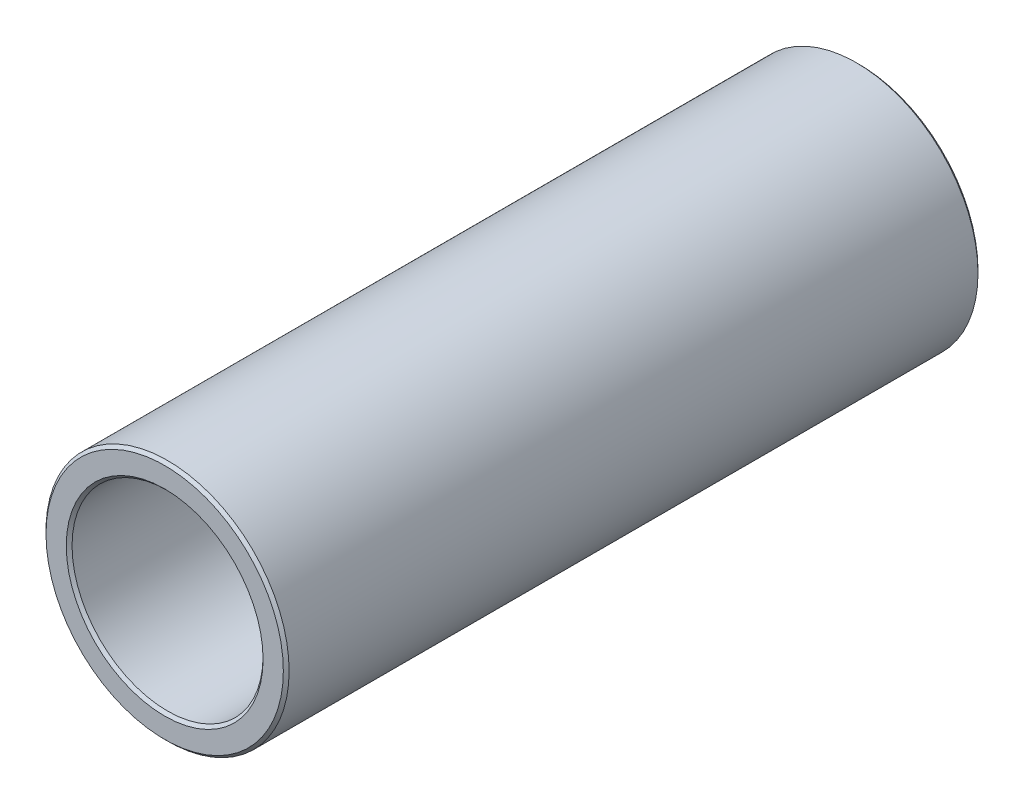
ISO-10303-21;
HEADER;
FILE_DESCRIPTION(('STEP AP214'),'2;1');
FILE_NAME('part.step','',(''),(''),'','','');
FILE_SCHEMA(('AUTOMOTIVE_DESIGN { 1 0 10303 214 1 1 1 1 }'));
ENDSEC;
DATA;
#1=APPLICATION_CONTEXT('core data for automotive mechanical design processes');
#2=APPLICATION_PROTOCOL_DEFINITION('international standard','automotive_design',2000,#1);
#3=PRODUCT_CONTEXT('',#1,'mechanical');
#4=PRODUCT('Part','Part','',(#3));
#5=PRODUCT_RELATED_PRODUCT_CATEGORY('part','',(#4));
#6=PRODUCT_DEFINITION_FORMATION('','',#4);
#7=PRODUCT_DEFINITION_CONTEXT('part definition',#1,'design');
#8=PRODUCT_DEFINITION('design','',#6,#7);
#9=PRODUCT_DEFINITION_SHAPE('','',#8);
#10=(LENGTH_UNIT() NAMED_UNIT(*) SI_UNIT(.MILLI.,.METRE.));
#11=(NAMED_UNIT(*) PLANE_ANGLE_UNIT() SI_UNIT($,.RADIAN.));
#12=(NAMED_UNIT(*) SI_UNIT($,.STERADIAN.) SOLID_ANGLE_UNIT());
#13=UNCERTAINTY_MEASURE_WITH_UNIT(LENGTH_MEASURE(1.E-05),#10,'distance_accuracy_value','');
#14=(GEOMETRIC_REPRESENTATION_CONTEXT(3) GLOBAL_UNCERTAINTY_ASSIGNED_CONTEXT((#13)) GLOBAL_UNIT_ASSIGNED_CONTEXT((#10,
#11,#12)) REPRESENTATION_CONTEXT('',''));
#15=CARTESIAN_POINT('',(0.,0.,0.));
#16=DIRECTION('',(0.,0.,1.));
#17=DIRECTION('',(1.,0.,0.));
#18=AXIS2_PLACEMENT_3D('',#15,#16,#17);
#19=CARTESIAN_POINT('',(0.,-3.33066907387547E-13,119.999999999999));
#20=DIRECTION('',(0.,0.,-0.999999999999981));
#21=DIRECTION('',(-1.00000000000002,0.,0.));
#22=AXIS2_PLACEMENT_3D('',#19,#20,#21);
#23=PLANE('',#22);
#24=CARTESIAN_POINT('',(0.,-3.33066907387547E-13,119.999999999999));
#25=DIRECTION('',(0.,0.,0.999999999999981));
#26=DIRECTION('',(1.00000000000002,0.,0.));
#27=AXIS2_PLACEMENT_3D('',#24,#25,#26);
#28=CIRCLE('',#27,20.5);
#29=CARTESIAN_POINT('',(20.5000000000003,-3.54688500792122E-13,119.999999999999));
#30=VERTEX_POINT('',#29);
#31=EDGE_CURVE('E52',#30,#30,#28,.T.);
#32=ORIENTED_EDGE('',*,*,#31,.T.);
#33=EDGE_LOOP('',(#32));
#34=FACE_BOUND('',#33,.T.);
#35=CARTESIAN_POINT('',(0.,-3.33066907387547E-13,119.999999999999));
#36=DIRECTION('',(0.,0.,0.999999999999981));
#37=DIRECTION('',(1.00000000000002,0.,0.));
#38=AXIS2_PLACEMENT_3D('',#35,#36,#37);
#39=CIRCLE('',#38,17.);
#40=CARTESIAN_POINT('',(16.9999999999999,-1.84478109588686E-13,119.999999999999));
#41=VERTEX_POINT('',#40);
#42=EDGE_CURVE('E74',#41,#41,#39,.T.);
#43=ORIENTED_EDGE('',*,*,#42,.F.);
#44=EDGE_LOOP('',(#43));
#45=FACE_BOUND('',#44,.T.);
#46=ADVANCED_FACE('F46',(#34,#45),#23,.F.);
#47=CARTESIAN_POINT('',(-7.63278329429795E-13,20.9999999999997,1.0547118733939E-12));
#48=DIRECTION('',(0.,0.,0.999999999999981));
#49=DIRECTION('',(1.00000000000002,0.,0.));
#50=AXIS2_PLACEMENT_3D('',#47,#48,#49);
#51=PLANE('',#50);
#52=CARTESIAN_POINT('',(0.,0.,0.));
#53=DIRECTION('',(0.,0.,0.999999999999981));
#54=DIRECTION('',(1.00000000000002,0.,0.));
#55=AXIS2_PLACEMENT_3D('',#52,#53,#54);
#56=CIRCLE('',#55,20.5);
#57=CARTESIAN_POINT('',(20.4999999999998,1.44926414336415E-13,0.));
#58=VERTEX_POINT('',#57);
#59=EDGE_CURVE('E56',#58,#58,#56,.T.);
#60=ORIENTED_EDGE('',*,*,#59,.F.);
#61=EDGE_LOOP('',(#60));
#62=FACE_BOUND('',#61,.T.);
#63=CARTESIAN_POINT('',(0.,0.,0.));
#64=DIRECTION('',(0.,0.,0.999999999999981));
#65=DIRECTION('',(1.00000000000002,0.,0.));
#66=AXIS2_PLACEMENT_3D('',#63,#64,#65);
#67=CIRCLE('',#66,8.);
#68=CARTESIAN_POINT('',(8.00000000000012,0.,0.));
#69=VERTEX_POINT('',#68);
#70=EDGE_CURVE('E71',#69,#69,#67,.T.);
#71=ORIENTED_EDGE('',*,*,#70,.T.);
#72=EDGE_LOOP('',(#71));
#73=FACE_BOUND('',#72,.T.);
#74=ADVANCED_FACE('F99',(#62,#73),#51,.F.);
#75=CARTESIAN_POINT('',(0.,0.,0.));
#76=DIRECTION('',(0.,0.,0.999999999999981));
#77=DIRECTION('',(1.00000000000002,0.,0.));
#78=AXIS2_PLACEMENT_3D('',#75,#76,#77);
#79=CYLINDRICAL_SURFACE('',#78,21.);
#80=CARTESIAN_POINT('',(-2.63677968348475E-13,-1.66533453693773E-13,119.499999999999));
#81=DIRECTION('',(0.,0.,0.999999999999981));
#82=DIRECTION('',(1.00000000000002,0.,0.));
#83=AXIS2_PLACEMENT_3D('',#80,#81,#82);
#84=CIRCLE('',#83,21.);
#85=CARTESIAN_POINT('',(21.0000000000006,0.,119.499999999999));
#86=VERTEX_POINT('',#85);
#87=EDGE_CURVE('E12',#86,#86,#84,.T.);
#88=CARTESIAN_POINT('',(-3.88578058618805E-13,1.66533453693773E-13,0.5));
#89=DIRECTION('',(0.,0.,0.999999999999981));
#90=DIRECTION('',(1.00000000000002,0.,0.));
#91=AXIS2_PLACEMENT_3D('',#88,#89,#90);
#92=CIRCLE('',#91,21.);
#93=CARTESIAN_POINT('',(21.0000000000003,0.,0.499999999999955));
#94=VERTEX_POINT('',#93);
#95=EDGE_CURVE('E60',#94,#94,#92,.T.);
#96=CARTESIAN_POINT('',(21.0000000000006,0.,119.499999999999));
#97=CARTESIAN_POINT('',(21.0000000000006,0.,118.260416666665));
#98=CARTESIAN_POINT('',(21.0000000000006,0.,117.020833333332));
#99=CARTESIAN_POINT('',(21.0000000000006,0.,114.541666666665));
#100=CARTESIAN_POINT('',(21.0000000000006,0.,113.302083333332));
#101=CARTESIAN_POINT('',(21.0000000000006,0.,110.822916666665));
#102=CARTESIAN_POINT('',(21.0000000000006,0.,109.583333333332));
#103=CARTESIAN_POINT('',(21.0000000000006,0.,107.104166666665));
#104=CARTESIAN_POINT('',(21.0000000000006,0.,105.864583333332));
#105=CARTESIAN_POINT('',(21.0000000000005,0.,103.385416666665));
#106=CARTESIAN_POINT('',(21.0000000000005,0.,102.145833333332));
#107=CARTESIAN_POINT('',(21.0000000000005,0.,99.6666666666655));
#108=CARTESIAN_POINT('',(21.0000000000005,0.,98.4270833333322));
#109=CARTESIAN_POINT('',(21.0000000000005,0.,95.9479166666655));
#110=CARTESIAN_POINT('',(21.0000000000005,0.,94.7083333333322));
#111=CARTESIAN_POINT('',(21.0000000000005,0.,92.2291666666656));
#112=CARTESIAN_POINT('',(21.0000000000005,0.,90.9895833333323));
#113=CARTESIAN_POINT('',(21.0000000000005,0.,88.5104166666656));
#114=CARTESIAN_POINT('',(21.0000000000005,0.,87.2708333333323));
#115=CARTESIAN_POINT('',(21.0000000000005,0.,84.7916666666657));
#116=CARTESIAN_POINT('',(21.0000000000005,0.,83.5520833333323));
#117=CARTESIAN_POINT('',(21.0000000000005,0.,81.0729166666657));
#118=CARTESIAN_POINT('',(21.0000000000005,0.,79.8333333333324));
#119=CARTESIAN_POINT('',(21.0000000000005,0.,77.3541666666657));
#120=CARTESIAN_POINT('',(21.0000000000005,0.,76.1145833333324));
#121=CARTESIAN_POINT('',(21.0000000000005,0.,73.6354166666658));
#122=CARTESIAN_POINT('',(21.0000000000005,0.,72.3958333333325));
#123=CARTESIAN_POINT('',(21.0000000000005,0.,69.9166666666658));
#124=CARTESIAN_POINT('',(21.0000000000005,0.,68.6770833333325));
#125=CARTESIAN_POINT('',(21.0000000000005,0.,66.1979166666659));
#126=CARTESIAN_POINT('',(21.0000000000005,0.,64.9583333333326));
#127=CARTESIAN_POINT('',(21.0000000000005,0.,62.4791666666659));
#128=CARTESIAN_POINT('',(21.0000000000005,0.,61.2395833333326));
#129=CARTESIAN_POINT('',(21.0000000000004,0.,58.760416666666));
#130=CARTESIAN_POINT('',(21.0000000000004,0.,57.5208333333326));
#131=CARTESIAN_POINT('',(21.0000000000004,0.,55.041666666666));
#132=CARTESIAN_POINT('',(21.0000000000004,0.,53.8020833333327));
#133=CARTESIAN_POINT('',(21.0000000000004,0.,51.3229166666661));
#134=CARTESIAN_POINT('',(21.0000000000004,0.,50.0833333333327));
#135=CARTESIAN_POINT('',(21.0000000000004,0.,47.6041666666661));
#136=CARTESIAN_POINT('',(21.0000000000004,0.,46.3645833333328));
#137=CARTESIAN_POINT('',(21.0000000000004,0.,43.8854166666661));
#138=CARTESIAN_POINT('',(21.0000000000004,0.,42.6458333333328));
#139=CARTESIAN_POINT('',(21.0000000000004,0.,40.1666666666662));
#140=CARTESIAN_POINT('',(21.0000000000004,0.,38.9270833333329));
#141=CARTESIAN_POINT('',(21.0000000000004,0.,36.4479166666662));
#142=CARTESIAN_POINT('',(21.0000000000004,0.,35.2083333333329));
#143=CARTESIAN_POINT('',(21.0000000000004,0.,32.7291666666663));
#144=CARTESIAN_POINT('',(21.0000000000004,0.,31.4895833333329));
#145=CARTESIAN_POINT('',(21.0000000000004,0.,29.0104166666663));
#146=CARTESIAN_POINT('',(21.0000000000004,0.,27.770833333333));
#147=CARTESIAN_POINT('',(21.0000000000004,0.,25.2916666666663));
#148=CARTESIAN_POINT('',(21.0000000000004,0.,24.052083333333));
#149=CARTESIAN_POINT('',(21.0000000000004,0.,21.5729166666664));
#150=CARTESIAN_POINT('',(21.0000000000004,0.,20.3333333333331));
#151=CARTESIAN_POINT('',(21.0000000000004,0.,17.8541666666664));
#152=CARTESIAN_POINT('',(21.0000000000004,0.,16.6145833333331));
#153=CARTESIAN_POINT('',(21.0000000000003,0.,14.1354166666665));
#154=CARTESIAN_POINT('',(21.0000000000003,0.,12.8958333333331));
#155=CARTESIAN_POINT('',(21.0000000000003,0.,10.4166666666665));
#156=CARTESIAN_POINT('',(21.0000000000003,0.,9.17708333333319));
#157=CARTESIAN_POINT('',(21.0000000000003,0.,6.69791666666655));
#158=CARTESIAN_POINT('',(21.0000000000003,0.,5.45833333333323));
#159=CARTESIAN_POINT('',(21.0000000000003,0.,2.9791666666666));
#160=CARTESIAN_POINT('',(21.0000000000003,0.,1.73958333333328));
#161=CARTESIAN_POINT('',(21.0000000000003,0.,0.499999999999953));
#162=B_SPLINE_CURVE_WITH_KNOTS('',3,(#96,#97,#98,#99,#100,#101,#102,#103,#104,#105,#106,#107,
#108,#109,#110,#111,#112,#113,#114,#115,#116,#117,#118,#119,#120,#121,#122,#123,#124,#125,#126,
#127,#128,#129,#130,#131,#132,#133,#134,#135,#136,#137,#138,#139,#140,#141,#142,#143,#144,#145,
#146,#147,#148,#149,#150,#151,#152,#153,#154,#155,#156,#157,#158,#159,#160,#161),.UNSPECIFIED.,
.F.,.F.,(4,2,2,2,2,2,2,2,2,2,2,2,2,2,2,2,2,2,2,2,2,2,2,2,2,2,2,2,2,2,2,2,4),(0.,
3.71874999999995,7.4374999999999,11.1562499999999,14.8749999999998,18.5937499999998,
22.3124999999997,26.0312499999997,29.7499999999997,33.4687499999996,37.1874999999996,
40.9062499999995,44.6249999999995,48.3437499999995,52.0624999999994,55.7812499999994,
59.4999999999993,63.2187499999993,66.9374999999992,70.6562499999992,74.3749999999991,
78.0937499999991,81.8124999999991,85.531249999999,89.249999999999,92.9687499999989,
96.6874999999989,100.406249999999,104.124999999999,107.843749999999,111.562499999999,
115.281249999999,118.999999999999),.UNSPECIFIED.);
#163=EDGE_CURVE('BSEAM103',#86,#94,#162,.T.);
#164=ORIENTED_EDGE('',*,*,#87,.F.);
#165=ORIENTED_EDGE('',*,*,#95,.T.);
#166=ORIENTED_EDGE('',*,*,#163,.T.);
#167=ORIENTED_EDGE('',*,*,#163,.F.);
#168=EDGE_LOOP('',(#164,#166,#165,#167));
#169=FACE_BOUND('',#168,.T.);
#170=ADVANCED_FACE('F103',(#169),#79,.T.);
#171=CARTESIAN_POINT('',(0.,-3.33066907387547E-13,119.999999999999));
#172=DIRECTION('',(0.,0.,-0.999999999999981));
#173=DIRECTION('',(-1.00000000000002,0.,0.));
#174=AXIS2_PLACEMENT_3D('',#171,#172,#173);
#175=CONICAL_SURFACE('',#174,20.5,0.785398163397462);
#176=ORIENTED_EDGE('',*,*,#87,.T.);
#177=EDGE_LOOP('',(#176));
#178=FACE_BOUND('',#177,.T.);
#179=ORIENTED_EDGE('',*,*,#31,.F.);
#180=EDGE_LOOP('',(#179));
#181=FACE_BOUND('',#180,.T.);
#182=ADVANCED_FACE('F113',(#178,#181),#175,.T.);
#183=CARTESIAN_POINT('',(-3.88578058618805E-13,1.66533453693773E-13,0.5));
#184=DIRECTION('',(0.,0.,0.999999999999981));
#185=DIRECTION('',(1.00000000000002,0.,0.));
#186=AXIS2_PLACEMENT_3D('',#183,#184,#185);
#187=CONICAL_SURFACE('',#186,21.,0.785398163397449);
#188=CARTESIAN_POINT('',(20.4999999999998,1.44926414336415E-13,0.));
#189=CARTESIAN_POINT('',(20.5052083333332,1.44920769440749E-13,0.00520833333328914));
#190=CARTESIAN_POINT('',(20.5104166666665,1.44915124545083E-13,0.0104166666666223));
#191=CARTESIAN_POINT('',(20.5208333333332,1.44903834753752E-13,0.0208333333332885));
#192=CARTESIAN_POINT('',(20.5260416666665,1.44898189858086E-13,0.0260416666666217));
#193=CARTESIAN_POINT('',(20.5364583333332,1.44886900066754E-13,0.0364583333332886));
#194=CARTESIAN_POINT('',(20.5416666666665,1.44881255171089E-13,0.0416666666666223));
#195=CARTESIAN_POINT('',(20.5520833333332,1.44869965379757E-13,0.052083333333289));
#196=CARTESIAN_POINT('',(20.5572916666665,1.44864320484091E-13,0.0572916666666221));
#197=CARTESIAN_POINT('',(20.5677083333332,1.4485303069276E-13,0.0677083333332886));
#198=CARTESIAN_POINT('',(20.5729166666665,1.44847385797094E-13,0.072916666666622));
#199=CARTESIAN_POINT('',(20.5833333333332,1.44836096005763E-13,0.0833333333332886));
#200=CARTESIAN_POINT('',(20.5885416666665,1.44830451110097E-13,0.0885416666666216));
#201=CARTESIAN_POINT('',(20.5989583333332,1.44819161318765E-13,0.0989583333332884));
#202=CARTESIAN_POINT('',(20.6041666666665,1.448135164231E-13,0.104166666666622));
#203=CARTESIAN_POINT('',(20.6145833333332,1.44802226631768E-13,0.114583333333289));
#204=CARTESIAN_POINT('',(20.6197916666665,1.44796581736102E-13,0.119791666666622));
#205=CARTESIAN_POINT('',(20.6302083333332,1.44785291944771E-13,0.130208333333288));
#206=CARTESIAN_POINT('',(20.6354166666665,1.44779647049105E-13,0.135416666666622));
#207=CARTESIAN_POINT('',(20.6458333333332,1.44768357257774E-13,0.145833333333288));
#208=CARTESIAN_POINT('',(20.6510416666665,1.44762712362108E-13,0.151041666666622));
#209=CARTESIAN_POINT('',(20.6614583333332,1.44751422570776E-13,0.161458333333289));
#210=CARTESIAN_POINT('',(20.6666666666665,1.4474577767511E-13,0.166666666666622));
#211=CARTESIAN_POINT('',(20.6770833333332,1.44734487883779E-13,0.177083333333288));
#212=CARTESIAN_POINT('',(20.6822916666665,1.44728842988113E-13,0.182291666666622));
#213=CARTESIAN_POINT('',(20.6927083333332,1.44717553196782E-13,0.192708333333289));
#214=CARTESIAN_POINT('',(20.6979166666665,1.44711908301116E-13,0.197916666666622));
#215=CARTESIAN_POINT('',(20.7083333333332,1.44700618509784E-13,0.208333333333288));
#216=CARTESIAN_POINT('',(20.7135416666665,1.44694973614119E-13,0.213541666666622));
#217=CARTESIAN_POINT('',(20.7239583333332,1.44683683822787E-13,0.223958333333289));
#218=CARTESIAN_POINT('',(20.7291666666665,1.44678038927121E-13,0.229166666666622));
#219=CARTESIAN_POINT('',(20.7395833333332,1.4466674913579E-13,0.239583333333288));
#220=CARTESIAN_POINT('',(20.7447916666665,1.44661104240124E-13,0.244791666666621));
#221=CARTESIAN_POINT('',(20.7552083333332,1.44649814448793E-13,0.255208333333288));
#222=CARTESIAN_POINT('',(20.7604166666665,1.44644169553127E-13,0.260416666666622));
#223=CARTESIAN_POINT('',(20.7708333333332,1.44632879761795E-13,0.270833333333289));
#224=CARTESIAN_POINT('',(20.7760416666665,1.44627234866129E-13,0.276041666666622));
#225=CARTESIAN_POINT('',(20.7864583333332,1.44615945074798E-13,0.286458333333288));
#226=CARTESIAN_POINT('',(20.7916666666665,1.44610300179132E-13,0.291666666666622));
#227=CARTESIAN_POINT('',(20.8020833333332,1.44599010387801E-13,0.302083333333288));
#228=CARTESIAN_POINT('',(20.8072916666665,1.44593365492135E-13,0.307291666666621));
#229=CARTESIAN_POINT('',(20.8177083333332,1.44582075700803E-13,0.317708333333288));
#230=CARTESIAN_POINT('',(20.8229166666665,1.44576430805138E-13,0.322916666666622));
#231=CARTESIAN_POINT('',(20.8333333333332,1.44565141013806E-13,0.333333333333289));
#232=CARTESIAN_POINT('',(20.8385416666665,1.4455949611814E-13,0.338541666666622));
#233=CARTESIAN_POINT('',(20.8489583333332,1.44548206326809E-13,0.348958333333288));
#234=CARTESIAN_POINT('',(20.8541666666665,1.44542561431143E-13,0.354166666666621));
#235=CARTESIAN_POINT('',(20.8645833333332,1.44531271639812E-13,0.364583333333288));
#236=CARTESIAN_POINT('',(20.8697916666665,1.44525626744146E-13,0.369791666666622));
#237=CARTESIAN_POINT('',(20.8802083333332,1.44514336952814E-13,0.380208333333289));
#238=CARTESIAN_POINT('',(20.8854166666665,1.44508692057148E-13,0.385416666666621));
#239=CARTESIAN_POINT('',(20.8958333333332,1.44497402265817E-13,0.395833333333288));
#240=CARTESIAN_POINT('',(20.9010416666665,1.44491757370151E-13,0.401041666666622));
#241=CARTESIAN_POINT('',(20.9114583333332,1.4448046757882E-13,0.411458333333289));
#242=CARTESIAN_POINT('',(20.9166666666665,1.44474822683154E-13,0.416666666666621));
#243=CARTESIAN_POINT('',(20.9270833333332,1.44463532891822E-13,0.427083333333288));
#244=CARTESIAN_POINT('',(20.9322916666665,1.44457887996157E-13,0.432291666666622));
#245=CARTESIAN_POINT('',(20.9427083333332,1.44446598204825E-13,0.442708333333289));
#246=CARTESIAN_POINT('',(20.9479166666665,1.44440953309159E-13,0.447916666666622));
#247=CARTESIAN_POINT('',(20.9583333333332,1.44429663517828E-13,0.458333333333288));
#248=CARTESIAN_POINT('',(20.9635416666665,1.44424018622162E-13,0.463541666666621));
#249=CARTESIAN_POINT('',(20.9739583333332,1.44412728830831E-13,0.473958333333288));
#250=CARTESIAN_POINT('',(20.9791666666665,1.44407083935165E-13,0.479166666666622));
#251=CARTESIAN_POINT('',(20.9895833333332,1.44395794143833E-13,0.489583333333289));
#252=CARTESIAN_POINT('',(20.9947916666665,1.44390149248167E-13,0.494791666666622));
#253=CARTESIAN_POINT('',(20.9999999999998,1.44384504352502E-13,0.499999999999955));
#254=B_SPLINE_CURVE_WITH_KNOTS('',3,(#188,#189,#190,#191,#192,#193,#194,#195,#196,#197,#198,
#199,#200,#201,#202,#203,#204,#205,#206,#207,#208,#209,#210,#211,#212,#213,#214,#215,#216,#217,
#218,#219,#220,#221,#222,#223,#224,#225,#226,#227,#228,#229,#230,#231,#232,#233,#234,#235,#236,
#237,#238,#239,#240,#241,#242,#243,#244,#245,#246,#247,#248,#249,#250,#251,#252,#253),
.UNSPECIFIED.,.F.,.F.,(4,2,2,2,2,2,2,2,2,2,2,2,2,2,2,2,2,2,2,2,2,2,2,2,2,2,2,2,2,2,2,2,4),(0.,
0.0220970869120808,0.0441941738241617,0.06629126073624,0.0883883476483209,0.110485434560402,
0.132582521472483,0.154679608384561,0.176776695296642,0.198873782208723,0.220970869120801,
0.243067956032882,0.26516504294496,0.287262129857041,0.309359216769119,0.3314563036812,
0.353553390593281,0.375650477505359,0.39774756441744,0.419844651329521,0.441941738241602,
0.46403882515368,0.486135912065761,0.508232998977842,0.53033008588992,0.552427172802001,
0.574524259714079,0.59662134662616,0.618718433538239,0.64081552045032,0.6629126073624,
0.685009694274479,0.70710678118656),.UNSPECIFIED.);
#255=EDGE_CURVE('BSEAM120',#58,#94,#254,.T.);
#256=ORIENTED_EDGE('',*,*,#59,.T.);
#257=ORIENTED_EDGE('',*,*,#95,.F.);
#258=ORIENTED_EDGE('',*,*,#255,.T.);
#259=ORIENTED_EDGE('',*,*,#255,.F.);
#260=EDGE_LOOP('',(#256,#258,#257,#259));
#261=FACE_BOUND('',#260,.T.);
#262=ADVANCED_FACE('F120',(#261),#187,.T.);
#263=CARTESIAN_POINT('',(-1.38777878078145E-13,0.,11.9175));
#264=DIRECTION('',(0.,0.,0.999999999999981));
#265=DIRECTION('',(1.00000000000002,0.,0.));
#266=AXIS2_PLACEMENT_3D('',#263,#264,#265);
#267=CONICAL_SURFACE('',#266,6.9175,1.45830687177095);
#268=CARTESIAN_POINT('',(-1.38777878078145E-13,-1.66533453693773E-13,13.));
#269=DIRECTION('',(0.,0.,0.999999999999981));
#270=DIRECTION('',(1.00000000000002,0.,0.));
#271=AXIS2_PLACEMENT_3D('',#268,#269,#270);
#272=CIRCLE('',#271,16.5);
#273=CARTESIAN_POINT('',(16.4999999999995,0.,13.));
#274=VERTEX_POINT('',#273);
#275=EDGE_CURVE('E80',#274,#274,#272,.T.);
#276=CARTESIAN_POINT('',(-1.38777878078145E-13,0.,11.9175));
#277=DIRECTION('',(0.,0.,0.999999999999981));
#278=DIRECTION('',(1.00000000000002,0.,0.));
#279=AXIS2_PLACEMENT_3D('',#276,#277,#278);
#280=CIRCLE('',#279,6.9175);
#281=CARTESIAN_POINT('',(6.9174999999997,0.,11.9175));
#282=VERTEX_POINT('',#281);
#283=EDGE_CURVE('E65',#282,#282,#280,.T.);
#284=CARTESIAN_POINT('',(16.4999999999995,0.,13.));
#285=CARTESIAN_POINT('',(16.4001822916662,0.,12.9887239583333));
#286=CARTESIAN_POINT('',(16.3003645833329,0.,12.9774479166666));
#287=CARTESIAN_POINT('',(16.1007291666662,0.,12.9548958333333));
#288=CARTESIAN_POINT('',(16.0009114583329,0.,12.9436197916667));
#289=CARTESIAN_POINT('',(15.8012760416662,0.,12.9210677083333));
#290=CARTESIAN_POINT('',(15.7014583333329,0.,12.9097916666667));
#291=CARTESIAN_POINT('',(15.5018229166662,0.,12.8872395833333));
#292=CARTESIAN_POINT('',(15.4020052083329,0.,12.8759635416667));
#293=CARTESIAN_POINT('',(15.2023697916662,0.,12.8534114583333));
#294=CARTESIAN_POINT('',(15.1025520833329,0.,12.8421354166667));
#295=CARTESIAN_POINT('',(14.9029166666662,0.,12.8195833333333));
#296=CARTESIAN_POINT('',(14.8030989583329,0.,12.8083072916667));
#297=CARTESIAN_POINT('',(14.6034635416662,0.,12.7857552083333));
#298=CARTESIAN_POINT('',(14.5036458333329,0.,12.7744791666667));
#299=CARTESIAN_POINT('',(14.3040104166662,0.,12.7519270833333));
#300=CARTESIAN_POINT('',(14.2041927083329,0.,12.7406510416667));
#301=CARTESIAN_POINT('',(14.0045572916662,0.,12.7180989583333));
#302=CARTESIAN_POINT('',(13.9047395833329,0.,12.7068229166667));
#303=CARTESIAN_POINT('',(13.7051041666662,0.,12.6842708333333));
#304=CARTESIAN_POINT('',(13.6052864583329,0.,12.6729947916667));
#305=CARTESIAN_POINT('',(13.4056510416663,0.,12.6504427083333));
#306=CARTESIAN_POINT('',(13.3058333333329,0.,12.6391666666667));
#307=CARTESIAN_POINT('',(13.1061979166663,0.,12.6166145833333));
#308=CARTESIAN_POINT('',(13.0063802083329,0.,12.6053385416667));
#309=CARTESIAN_POINT('',(12.8067447916663,0.,12.5827864583333));
#310=CARTESIAN_POINT('',(12.7069270833329,0.,12.5715104166667));
#311=CARTESIAN_POINT('',(12.5072916666663,0.,12.5489583333333));
#312=CARTESIAN_POINT('',(12.4074739583329,0.,12.5376822916667));
#313=CARTESIAN_POINT('',(12.2078385416663,0.,12.5151302083333));
#314=CARTESIAN_POINT('',(12.1080208333329,0.,12.5038541666667));
#315=CARTESIAN_POINT('',(11.9083854166663,0.,12.4813020833333));
#316=CARTESIAN_POINT('',(11.8085677083329,0.,12.4700260416667));
#317=CARTESIAN_POINT('',(11.6089322916663,0.,12.4474739583333));
#318=CARTESIAN_POINT('',(11.509114583333,0.,12.4361979166667));
#319=CARTESIAN_POINT('',(11.3094791666663,0.,12.4136458333333));
#320=CARTESIAN_POINT('',(11.209661458333,0.,12.4023697916667));
#321=CARTESIAN_POINT('',(11.0100260416663,0.,12.3798177083333));
#322=CARTESIAN_POINT('',(10.910208333333,0.,12.3685416666667));
#323=CARTESIAN_POINT('',(10.7105729166663,0.,12.3459895833333));
#324=CARTESIAN_POINT('',(10.610755208333,0.,12.3347135416667));
#325=CARTESIAN_POINT('',(10.4111197916663,0.,12.3121614583333));
#326=CARTESIAN_POINT('',(10.311302083333,0.,12.3008854166667));
#327=CARTESIAN_POINT('',(10.1116666666663,0.,12.2783333333333));
#328=CARTESIAN_POINT('',(10.011848958333,0.,12.2670572916667));
#329=CARTESIAN_POINT('',(9.81221354166632,0.,12.2445052083333));
#330=CARTESIAN_POINT('',(9.71239583333298,0.,12.2332291666667));
#331=CARTESIAN_POINT('',(9.51276041666632,0.,12.2106770833333));
#332=CARTESIAN_POINT('',(9.41294270833299,0.,12.1994010416667));
#333=CARTESIAN_POINT('',(9.21330729166633,0.,12.1768489583333));
#334=CARTESIAN_POINT('',(9.11348958333299,0.,12.1655729166667));
#335=CARTESIAN_POINT('',(8.91385416666633,0.,12.1430208333333));
#336=CARTESIAN_POINT('',(8.814036458333,0.,12.1317447916667));
#337=CARTESIAN_POINT('',(8.61440104166634,0.,12.1091927083333));
#338=CARTESIAN_POINT('',(8.514583333333,0.,12.0979166666667));
#339=CARTESIAN_POINT('',(8.31494791666634,0.,12.0753645833333));
#340=CARTESIAN_POINT('',(8.21513020833301,0.,12.0640885416667));
#341=CARTESIAN_POINT('',(8.01549479166635,0.,12.0415364583333));
#342=CARTESIAN_POINT('',(7.91567708333301,0.,12.0302604166667));
#343=CARTESIAN_POINT('',(7.71604166666635,0.,12.0077083333333));
#344=CARTESIAN_POINT('',(7.61622395833302,0.,11.9964322916667));
#345=CARTESIAN_POINT('',(7.41658854166636,0.,11.9738802083333));
#346=CARTESIAN_POINT('',(7.31677083333302,0.,11.9626041666667));
#347=CARTESIAN_POINT('',(7.11713541666636,0.,11.9400520833334));
#348=CARTESIAN_POINT('',(7.01731770833303,0.,11.9287760416667));
#349=CARTESIAN_POINT('',(6.9174999999997,0.,11.9175));
#350=B_SPLINE_CURVE_WITH_KNOTS('',3,(#284,#285,#286,#287,#288,#289,#290,#291,#292,#293,#294,
#295,#296,#297,#298,#299,#300,#301,#302,#303,#304,#305,#306,#307,#308,#309,#310,#311,#312,#313,
#314,#315,#316,#317,#318,#319,#320,#321,#322,#323,#324,#325,#326,#327,#328,#329,#330,#331,#332,
#333,#334,#335,#336,#337,#338,#339,#340,#341,#342,#343,#344,#345,#346,#347,#348,#349),
.UNSPECIFIED.,.F.,.F.,(4,2,2,2,2,2,2,2,2,2,2,2,2,2,2,2,2,2,2,2,2,2,2,2,2,2,2,2,2,2,2,2,4),(0.,
0.30135778754377,0.602715575087547,0.904073362631321,1.2054311501751,1.50678893771887,
1.80814672526264,2.10950451280642,2.41086230035019,2.71222008789396,3.01357787543774,
3.31493566298151,3.61629345052528,3.91765123806906,4.21900902561283,4.5203668131566,
4.82172460070038,5.12308238824415,5.42444017578792,5.7257979633317,6.02715575087547,
6.32851353841924,6.62987132596302,6.93122911350679,7.23258690105057,7.53394468859434,
7.83530247613811,8.13666026368189,8.43801805122566,8.73937583876944,9.04073362631321,
9.34209141385698,9.64344920140075),.UNSPECIFIED.);
#351=EDGE_CURVE('BSEAM84',#274,#282,#350,.T.);
#352=ORIENTED_EDGE('',*,*,#275,.T.);
#353=ORIENTED_EDGE('',*,*,#283,.F.);
#354=ORIENTED_EDGE('',*,*,#351,.T.);
#355=ORIENTED_EDGE('',*,*,#351,.F.);
#356=EDGE_LOOP('',(#352,#354,#353,#355));
#357=FACE_BOUND('',#356,.T.);
#358=ADVANCED_FACE('F84',(#357),#267,.F.);
#359=CARTESIAN_POINT('',(0.,0.,0.));
#360=DIRECTION('',(0.,0.,0.999999999999981));
#361=DIRECTION('',(1.00000000000002,0.,0.));
#362=AXIS2_PLACEMENT_3D('',#359,#360,#361);
#363=CYLINDRICAL_SURFACE('',#362,6.9175);
#364=CARTESIAN_POINT('',(-3.88578058618805E-13,0.,1.08249999999999));
#365=DIRECTION('',(0.,0.,0.999999999999981));
#366=DIRECTION('',(1.00000000000002,0.,0.));
#367=AXIS2_PLACEMENT_3D('',#364,#365,#366);
#368=CIRCLE('',#367,6.9175);
#369=CARTESIAN_POINT('',(6.91750000000011,0.,1.08249999999997));
#370=VERTEX_POINT('',#369);
#371=EDGE_CURVE('E68',#370,#370,#368,.T.);
#372=CARTESIAN_POINT('',(6.91750000000013,0.,11.9175));
#373=CARTESIAN_POINT('',(6.91750000000013,0.,11.8046354166667));
#374=CARTESIAN_POINT('',(6.91750000000013,0.,11.6917708333333));
#375=CARTESIAN_POINT('',(6.91750000000013,0.,11.4660416666667));
#376=CARTESIAN_POINT('',(6.91750000000013,0.,11.3531770833333));
#377=CARTESIAN_POINT('',(6.91750000000013,0.,11.1274479166667));
#378=CARTESIAN_POINT('',(6.91750000000013,0.,11.0145833333333));
#379=CARTESIAN_POINT('',(6.91750000000013,0.,10.7888541666667));
#380=CARTESIAN_POINT('',(6.91750000000013,0.,10.6759895833333));
#381=CARTESIAN_POINT('',(6.91750000000013,0.,10.4502604166667));
#382=CARTESIAN_POINT('',(6.91750000000013,0.,10.3373958333333));
#383=CARTESIAN_POINT('',(6.91750000000013,0.,10.1116666666667));
#384=CARTESIAN_POINT('',(6.91750000000013,0.,9.99880208333334));
#385=CARTESIAN_POINT('',(6.91750000000013,0.,9.77307291666667));
#386=CARTESIAN_POINT('',(6.91750000000013,0.,9.66020833333334));
#387=CARTESIAN_POINT('',(6.91750000000013,0.,9.43447916666667));
#388=CARTESIAN_POINT('',(6.91750000000012,0.,9.32161458333334));
#389=CARTESIAN_POINT('',(6.91750000000012,0.,9.09588541666667));
#390=CARTESIAN_POINT('',(6.91750000000012,0.,8.98302083333334));
#391=CARTESIAN_POINT('',(6.91750000000012,0.,8.75729166666667));
#392=CARTESIAN_POINT('',(6.91750000000012,0.,8.64442708333334));
#393=CARTESIAN_POINT('',(6.91750000000012,0.,8.41869791666667));
#394=CARTESIAN_POINT('',(6.91750000000012,0.,8.30583333333334));
#395=CARTESIAN_POINT('',(6.91750000000012,0.,8.08010416666667));
#396=CARTESIAN_POINT('',(6.91750000000012,0.,7.96723958333333));
#397=CARTESIAN_POINT('',(6.91750000000012,0.,7.74151041666667));
#398=CARTESIAN_POINT('',(6.91750000000012,0.,7.62864583333333));
#399=CARTESIAN_POINT('',(6.91750000000012,0.,7.40291666666666));
#400=CARTESIAN_POINT('',(6.91750000000012,0.,7.29005208333333));
#401=CARTESIAN_POINT('',(6.91750000000012,0.,7.06432291666666));
#402=CARTESIAN_POINT('',(6.91750000000012,0.,6.95145833333333));
#403=CARTESIAN_POINT('',(6.91750000000012,0.,6.72572916666666));
#404=CARTESIAN_POINT('',(6.91750000000012,0.,6.61286458333333));
#405=CARTESIAN_POINT('',(6.91750000000012,0.,6.38713541666666));
#406=CARTESIAN_POINT('',(6.91750000000012,0.,6.27427083333333));
#407=CARTESIAN_POINT('',(6.91750000000012,0.,6.04854166666666));
#408=CARTESIAN_POINT('',(6.91750000000012,0.,5.93567708333332));
#409=CARTESIAN_POINT('',(6.91750000000012,0.,5.70994791666666));
#410=CARTESIAN_POINT('',(6.91750000000012,0.,5.59708333333332));
#411=CARTESIAN_POINT('',(6.91750000000012,0.,5.37135416666666));
#412=CARTESIAN_POINT('',(6.91750000000012,0.,5.25848958333332));
#413=CARTESIAN_POINT('',(6.91750000000012,0.,5.03276041666665));
#414=CARTESIAN_POINT('',(6.91750000000012,0.,4.91989583333332));
#415=CARTESIAN_POINT('',(6.91750000000012,0.,4.69416666666665));
#416=CARTESIAN_POINT('',(6.91750000000011,0.,4.58130208333332));
#417=CARTESIAN_POINT('',(6.91750000000011,0.,4.35557291666665));
#418=CARTESIAN_POINT('',(6.91750000000011,0.,4.24270833333332));
#419=CARTESIAN_POINT('',(6.91750000000011,0.,4.01697916666665));
#420=CARTESIAN_POINT('',(6.91750000000011,0.,3.90411458333332));
#421=CARTESIAN_POINT('',(6.91750000000011,0.,3.67838541666665));
#422=CARTESIAN_POINT('',(6.91750000000011,0.,3.56552083333331));
#423=CARTESIAN_POINT('',(6.91750000000011,0.,3.33979166666665));
#424=CARTESIAN_POINT('',(6.91750000000011,0.,3.22692708333331));
#425=CARTESIAN_POINT('',(6.91750000000011,0.,3.00119791666665));
#426=CARTESIAN_POINT('',(6.91750000000011,0.,2.88833333333331));
#427=CARTESIAN_POINT('',(6.91750000000011,0.,2.66260416666664));
#428=CARTESIAN_POINT('',(6.91750000000011,0.,2.54973958333331));
#429=CARTESIAN_POINT('',(6.91750000000011,0.,2.32401041666664));
#430=CARTESIAN_POINT('',(6.91750000000011,0.,2.21114583333331));
#431=CARTESIAN_POINT('',(6.91750000000011,0.,1.98541666666664));
#432=CARTESIAN_POINT('',(6.91750000000011,0.,1.87255208333331));
#433=CARTESIAN_POINT('',(6.91750000000011,0.,1.64682291666664));
#434=CARTESIAN_POINT('',(6.91750000000011,0.,1.53395833333331));
#435=CARTESIAN_POINT('',(6.91750000000011,0.,1.30822916666664));
#436=CARTESIAN_POINT('',(6.91750000000011,0.,1.1953645833333));
#437=CARTESIAN_POINT('',(6.91750000000011,0.,1.08249999999997));
#438=B_SPLINE_CURVE_WITH_KNOTS('',3,(#372,#373,#374,#375,#376,#377,#378,#379,#380,#381,#382,
#383,#384,#385,#386,#387,#388,#389,#390,#391,#392,#393,#394,#395,#396,#397,#398,#399,#400,#401,
#402,#403,#404,#405,#406,#407,#408,#409,#410,#411,#412,#413,#414,#415,#416,#417,#418,#419,#420,
#421,#422,#423,#424,#425,#426,#427,#428,#429,#430,#431,#432,#433,#434,#435,#436,#437),
.UNSPECIFIED.,.F.,.F.,(4,2,2,2,2,2,2,2,2,2,2,2,2,2,2,2,2,2,2,2,2,2,2,2,2,2,2,2,2,2,2,2,4),(0.,
0.338593750000001,0.677187500000002,1.01578125000001,1.354375,1.69296875000001,2.03156250000001,
2.37015625000001,2.70875000000001,3.04734375000001,3.38593750000001,3.72453125000002,
4.06312500000002,4.40171875000002,4.74031250000002,5.07890625000002,5.41750000000002,
5.75609375000002,6.09468750000003,6.43328125000003,6.77187500000003,7.11046875000003,
7.44906250000003,7.78765625000003,8.12625000000004,8.46484375000004,8.80343750000004,
9.14203125000004,9.48062500000004,9.81921875000004,10.1578125,10.49640625,10.835),.UNSPECIFIED.);
#439=EDGE_CURVE('BSEAM126',#282,#370,#438,.T.);
#440=ORIENTED_EDGE('',*,*,#283,.T.);
#441=ORIENTED_EDGE('',*,*,#371,.F.);
#442=ORIENTED_EDGE('',*,*,#439,.T.);
#443=ORIENTED_EDGE('',*,*,#439,.F.);
#444=EDGE_LOOP('',(#440,#442,#441,#443));
#445=FACE_BOUND('',#444,.T.);
#446=ADVANCED_FACE('F126',(#445),#363,.F.);
#447=CARTESIAN_POINT('',(0.,0.,0.));
#448=DIRECTION('',(0.,0.,-0.999999999999981));
#449=DIRECTION('',(-1.00000000000002,0.,0.));
#450=AXIS2_PLACEMENT_3D('',#447,#448,#449);
#451=CONICAL_SURFACE('',#450,8.,0.785398163397448);
#452=ORIENTED_EDGE('',*,*,#371,.T.);
#453=EDGE_LOOP('',(#452));
#454=FACE_BOUND('',#453,.T.);
#455=ORIENTED_EDGE('',*,*,#70,.F.);
#456=EDGE_LOOP('',(#455));
#457=FACE_BOUND('',#456,.T.);
#458=ADVANCED_FACE('F95',(#454,#457),#451,.F.);
#459=CARTESIAN_POINT('',(-2.63677968348475E-13,-1.66533453693773E-13,119.499999999999));
#460=DIRECTION('',(0.,0.,0.999999999999981));
#461=DIRECTION('',(1.00000000000002,0.,0.));
#462=AXIS2_PLACEMENT_3D('',#459,#460,#461);
#463=CONICAL_SURFACE('',#462,16.5,0.785398163397462);
#464=CARTESIAN_POINT('',(-2.63677968348475E-13,-1.66533453693773E-13,119.499999999999));
#465=DIRECTION('',(0.,0.,0.999999999999981));
#466=DIRECTION('',(1.00000000000002,0.,0.));
#467=AXIS2_PLACEMENT_3D('',#464,#465,#466);
#468=CIRCLE('',#467,16.5);
#469=CARTESIAN_POINT('',(16.4999999999999,-1.83936199604773E-13,119.499999999999));
#470=VERTEX_POINT('',#469);
#471=EDGE_CURVE('E77',#470,#470,#468,.T.);
#472=CARTESIAN_POINT('',(16.9999999999999,-1.84478109588686E-13,119.999999999999));
#473=CARTESIAN_POINT('',(16.9947916666665,-1.8447246469302E-13,119.994791666665));
#474=CARTESIAN_POINT('',(16.9895833333332,-1.84466819797354E-13,119.989583333332));
#475=CARTESIAN_POINT('',(16.9791666666666,-1.84455530006023E-13,119.979166666665));
#476=CARTESIAN_POINT('',(16.9739583333332,-1.84449885110357E-13,119.973958333332));
#477=CARTESIAN_POINT('',(16.9635416666666,-1.84438595319025E-13,119.963541666665));
#478=CARTESIAN_POINT('',(16.9583333333332,-1.8443295042336E-13,119.958333333332));
#479=CARTESIAN_POINT('',(16.9479166666666,-1.84421660632028E-13,119.947916666665));
#480=CARTESIAN_POINT('',(16.9427083333332,-1.84416015736362E-13,119.942708333332));
#481=CARTESIAN_POINT('',(16.9322916666666,-1.84404725945031E-13,119.932291666665));
#482=CARTESIAN_POINT('',(16.9270833333332,-1.84399081049365E-13,119.927083333332));
#483=CARTESIAN_POINT('',(16.9166666666666,-1.84387791258034E-13,119.916666666665));
#484=CARTESIAN_POINT('',(16.9114583333332,-1.84382146362368E-13,119.911458333332));
#485=CARTESIAN_POINT('',(16.9010416666666,-1.84370856571036E-13,119.901041666665));
#486=CARTESIAN_POINT('',(16.8958333333332,-1.84365211675371E-13,119.895833333332));
#487=CARTESIAN_POINT('',(16.8854166666666,-1.84353921884039E-13,119.885416666665));
#488=CARTESIAN_POINT('',(16.8802083333332,-1.84348276988373E-13,119.880208333332));
#489=CARTESIAN_POINT('',(16.8697916666666,-1.84336987197042E-13,119.869791666665));
#490=CARTESIAN_POINT('',(16.8645833333332,-1.84331342301376E-13,119.864583333332));
#491=CARTESIAN_POINT('',(16.8541666666666,-1.84320052510045E-13,119.854166666665));
#492=CARTESIAN_POINT('',(16.8489583333332,-1.84314407614379E-13,119.848958333332));
#493=CARTESIAN_POINT('',(16.8385416666666,-1.84303117823047E-13,119.838541666665));
#494=CARTESIAN_POINT('',(16.8333333333332,-1.84297472927381E-13,119.833333333332));
#495=CARTESIAN_POINT('',(16.8229166666666,-1.8428618313605E-13,119.822916666665));
#496=CARTESIAN_POINT('',(16.8177083333332,-1.84280538240384E-13,119.817708333332));
#497=CARTESIAN_POINT('',(16.8072916666666,-1.84269248449053E-13,119.807291666665));
#498=CARTESIAN_POINT('',(16.8020833333332,-1.84263603553387E-13,119.802083333332));
#499=CARTESIAN_POINT('',(16.7916666666666,-1.84252313762055E-13,119.791666666665));
#500=CARTESIAN_POINT('',(16.7864583333332,-1.8424666886639E-13,119.786458333332));
#501=CARTESIAN_POINT('',(16.7760416666666,-1.84235379075058E-13,119.776041666665));
#502=CARTESIAN_POINT('',(16.7708333333332,-1.84229734179392E-13,119.770833333332));
#503=CARTESIAN_POINT('',(16.7604166666666,-1.84218444388061E-13,119.760416666665));
#504=CARTESIAN_POINT('',(16.7552083333332,-1.84212799492395E-13,119.755208333332));
#505=CARTESIAN_POINT('',(16.7447916666666,-1.84201509701064E-13,119.744791666665));
#506=CARTESIAN_POINT('',(16.7395833333332,-1.84195864805398E-13,119.739583333332));
#507=CARTESIAN_POINT('',(16.7291666666666,-1.84184575014066E-13,119.729166666665));
#508=CARTESIAN_POINT('',(16.7239583333332,-1.841789301184E-13,119.723958333332));
#509=CARTESIAN_POINT('',(16.7135416666666,-1.84167640327069E-13,119.713541666665));
#510=CARTESIAN_POINT('',(16.7083333333332,-1.84161995431403E-13,119.708333333332));
#511=CARTESIAN_POINT('',(16.6979166666666,-1.84150705640072E-13,119.697916666665));
#512=CARTESIAN_POINT('',(16.6927083333332,-1.84145060744406E-13,119.692708333332));
#513=CARTESIAN_POINT('',(16.6822916666666,-1.84133770953074E-13,119.682291666665));
#514=CARTESIAN_POINT('',(16.6770833333332,-1.84128126057409E-13,119.677083333332));
#515=CARTESIAN_POINT('',(16.6666666666666,-1.84116836266077E-13,119.666666666665));
#516=CARTESIAN_POINT('',(16.6614583333332,-1.84111191370411E-13,119.661458333332));
#517=CARTESIAN_POINT('',(16.6510416666666,-1.8409990157908E-13,119.651041666665));
#518=CARTESIAN_POINT('',(16.6458333333332,-1.84094256683414E-13,119.645833333332));
#519=CARTESIAN_POINT('',(16.6354166666666,-1.84082966892083E-13,119.635416666665));
#520=CARTESIAN_POINT('',(16.6302083333332,-1.84077321996417E-13,119.630208333332));
#521=CARTESIAN_POINT('',(16.6197916666666,-1.84066032205085E-13,119.619791666665));
#522=CARTESIAN_POINT('',(16.6145833333332,-1.84060387309419E-13,119.614583333332));
#523=CARTESIAN_POINT('',(16.6041666666666,-1.84049097518088E-13,119.604166666665));
#524=CARTESIAN_POINT('',(16.5989583333332,-1.84043452622422E-13,119.598958333332));
#525=CARTESIAN_POINT('',(16.5885416666666,-1.84032162831091E-13,119.588541666665));
#526=CARTESIAN_POINT('',(16.5833333333332,-1.84026517935425E-13,119.583333333332));
#527=CARTESIAN_POINT('',(16.5729166666666,-1.84015228144093E-13,119.572916666665));
#528=CARTESIAN_POINT('',(16.5677083333332,-1.84009583248428E-13,119.567708333332));
#529=CARTESIAN_POINT('',(16.5572916666666,-1.83998293457096E-13,119.557291666665));
#530=CARTESIAN_POINT('',(16.5520833333332,-1.8399264856143E-13,119.552083333332));
#531=CARTESIAN_POINT('',(16.5416666666666,-1.83981358770099E-13,119.541666666665));
#532=CARTESIAN_POINT('',(16.5364583333332,-1.83975713874433E-13,119.536458333332));
#533=CARTESIAN_POINT('',(16.5260416666666,-1.83964424083102E-13,119.526041666665));
#534=CARTESIAN_POINT('',(16.5208333333332,-1.83958779187436E-13,119.520833333332));
#535=CARTESIAN_POINT('',(16.5104166666666,-1.83947489396104E-13,119.510416666665));
#536=CARTESIAN_POINT('',(16.5052083333332,-1.83941844500438E-13,119.505208333332));
#537=CARTESIAN_POINT('',(16.4999999999999,-1.83936199604773E-13,119.499999999999));
#538=B_SPLINE_CURVE_WITH_KNOTS('',3,(#472,#473,#474,#475,#476,#477,#478,#479,#480,#481,#482,
#483,#484,#485,#486,#487,#488,#489,#490,#491,#492,#493,#494,#495,#496,#497,#498,#499,#500,#501,
#502,#503,#504,#505,#506,#507,#508,#509,#510,#511,#512,#513,#514,#515,#516,#517,#518,#519,#520,
#521,#522,#523,#524,#525,#526,#527,#528,#529,#530,#531,#532,#533,#534,#535,#536,#537),
.UNSPECIFIED.,.F.,.F.,(4,2,2,2,2,2,2,2,2,2,2,2,2,2,2,2,2,2,2,2,2,2,2,2,2,2,2,2,2,2,2,2,4),(0.,
0.0220970869120747,0.0441941738241568,0.0662912607362291,0.0883883476483112,0.110485434560383,
0.132582521472468,0.15467960838454,0.176776695296625,0.198873782208697,0.220970869120779,
0.243067956032854,0.265165042944936,0.287262129857008,0.30935921676909,0.331456303681163,
0.353553390593247,0.375650477505319,0.397747564417401,0.419844651329474,0.441941738241558,
0.46403882515363,0.486135912065715,0.508232998977787,0.530330085889869,0.552427172801944,
0.574524259714026,0.596621346626099,0.618718433538171,0.640815520450253,0.662912607362328,
0.68500969427441,0.707106781186482),.UNSPECIFIED.);
#539=EDGE_CURVE('BSEAM89',#41,#470,#538,.T.);
#540=ORIENTED_EDGE('',*,*,#42,.T.);
#541=ORIENTED_EDGE('',*,*,#471,.F.);
#542=ORIENTED_EDGE('',*,*,#539,.T.);
#543=ORIENTED_EDGE('',*,*,#539,.F.);
#544=EDGE_LOOP('',(#540,#542,#541,#543));
#545=FACE_BOUND('',#544,.T.);
#546=ADVANCED_FACE('F89',(#545),#463,.F.);
#547=CARTESIAN_POINT('',(-1.38777878078145E-13,-1.66533453693773E-13,13.));
#548=DIRECTION('',(0.,0.,0.999999999999981));
#549=DIRECTION('',(1.00000000000002,0.,0.));
#550=AXIS2_PLACEMENT_3D('',#547,#548,#549);
#551=CYLINDRICAL_SURFACE('',#550,16.5);
#552=CARTESIAN_POINT('',(16.5000000000003,-1.87036211661817E-13,119.499999999999));
#553=CARTESIAN_POINT('',(16.5000000000003,-1.87003919869556E-13,118.390624999999));
#554=CARTESIAN_POINT('',(16.5000000000003,-1.86971628077295E-13,117.281249999999));
#555=CARTESIAN_POINT('',(16.5000000000003,-1.86907044492773E-13,115.062499999999));
#556=CARTESIAN_POINT('',(16.5000000000003,-1.86874752700512E-13,113.953124999999));
#557=CARTESIAN_POINT('',(16.5000000000003,-1.8681016911599E-13,111.734374999999));
#558=CARTESIAN_POINT('',(16.5000000000003,-1.8677787732373E-13,110.624999999999));
#559=CARTESIAN_POINT('',(16.5000000000003,-1.86713293739208E-13,108.406249999999));
#560=CARTESIAN_POINT('',(16.5000000000003,-1.86681001946947E-13,107.296874999999));
#561=CARTESIAN_POINT('',(16.5000000000003,-1.86616418362425E-13,105.078124999999));
#562=CARTESIAN_POINT('',(16.5000000000003,-1.86584126570164E-13,103.968749999999));
#563=CARTESIAN_POINT('',(16.5000000000003,-1.86519542985643E-13,101.749999999999));
#564=CARTESIAN_POINT('',(16.5000000000003,-1.86487251193382E-13,100.640624999999));
#565=CARTESIAN_POINT('',(16.5000000000003,-1.8642266760886E-13,98.4218749999989));
#566=CARTESIAN_POINT('',(16.5000000000003,-1.86390375816599E-13,97.3124999999989));
#567=CARTESIAN_POINT('',(16.5000000000003,-1.86325792232077E-13,95.0937499999989));
#568=CARTESIAN_POINT('',(16.5000000000003,-1.86293500439816E-13,93.9843749999989));
#569=CARTESIAN_POINT('',(16.5000000000003,-1.86228916855295E-13,91.765624999999));
#570=CARTESIAN_POINT('',(16.5000000000003,-1.86196625063034E-13,90.656249999999));
#571=CARTESIAN_POINT('',(16.5000000000003,-1.86132041478512E-13,88.437499999999));
#572=CARTESIAN_POINT('',(16.5000000000003,-1.86099749686251E-13,87.328124999999));
#573=CARTESIAN_POINT('',(16.5000000000003,-1.86035166101729E-13,85.1093749999991));
#574=CARTESIAN_POINT('',(16.5000000000003,-1.86002874309469E-13,83.9999999999991));
#575=CARTESIAN_POINT('',(16.5000000000003,-1.85938290724947E-13,81.7812499999991));
#576=CARTESIAN_POINT('',(16.5000000000003,-1.85905998932686E-13,80.6718749999991));
#577=CARTESIAN_POINT('',(16.5000000000003,-1.85841415348164E-13,78.4531249999991));
#578=CARTESIAN_POINT('',(16.5000000000003,-1.85809123555903E-13,77.3437499999992));
#579=CARTESIAN_POINT('',(16.5000000000002,-1.85744539971382E-13,75.1249999999992));
#580=CARTESIAN_POINT('',(16.5000000000002,-1.85712248179121E-13,74.0156249999992));
#581=CARTESIAN_POINT('',(16.5000000000002,-1.85647664594599E-13,71.7968749999992));
#582=CARTESIAN_POINT('',(16.5000000000002,-1.85615372802338E-13,70.6874999999992));
#583=CARTESIAN_POINT('',(16.5000000000002,-1.85550789217816E-13,68.4687499999993));
#584=CARTESIAN_POINT('',(16.5000000000002,-1.85518497425556E-13,67.3593749999993));
#585=CARTESIAN_POINT('',(16.5000000000002,-1.85453913841034E-13,65.1406249999993));
#586=CARTESIAN_POINT('',(16.5000000000002,-1.85421622048773E-13,64.0312499999993));
#587=CARTESIAN_POINT('',(16.5000000000002,-1.85357038464251E-13,61.8124999999994));
#588=CARTESIAN_POINT('',(16.5000000000002,-1.8532474667199E-13,60.7031249999994));
#589=CARTESIAN_POINT('',(16.5000000000002,-1.85260163087469E-13,58.4843749999994));
#590=CARTESIAN_POINT('',(16.5000000000002,-1.85227871295208E-13,57.3749999999994));
#591=CARTESIAN_POINT('',(16.5000000000002,-1.85163287710686E-13,55.1562499999994));
#592=CARTESIAN_POINT('',(16.5000000000002,-1.85130995918425E-13,54.0468749999995));
#593=CARTESIAN_POINT('',(16.5000000000002,-1.85066412333903E-13,51.8281249999995));
#594=CARTESIAN_POINT('',(16.5000000000002,-1.85034120541642E-13,50.7187499999995));
#595=CARTESIAN_POINT('',(16.5000000000002,-1.84969536957121E-13,48.4999999999995));
#596=CARTESIAN_POINT('',(16.5000000000002,-1.8493724516486E-13,47.3906249999995));
#597=CARTESIAN_POINT('',(16.5000000000002,-1.84872661580338E-13,45.1718749999996));
#598=CARTESIAN_POINT('',(16.5000000000002,-1.84840369788077E-13,44.0624999999996));
#599=CARTESIAN_POINT('',(16.5000000000002,-1.84775786203555E-13,41.8437499999996));
#600=CARTESIAN_POINT('',(16.5000000000002,-1.84743494411295E-13,40.7343749999996));
#601=CARTESIAN_POINT('',(16.5000000000002,-1.84678910826773E-13,38.5156249999997));
#602=CARTESIAN_POINT('',(16.5000000000002,-1.84646619034512E-13,37.4062499999997));
#603=CARTESIAN_POINT('',(16.5000000000002,-1.8458203544999E-13,35.1874999999997));
#604=CARTESIAN_POINT('',(16.5000000000002,-1.84549743657729E-13,34.0781249999997));
#605=CARTESIAN_POINT('',(16.5000000000002,-1.84485160073208E-13,31.8593749999997));
#606=CARTESIAN_POINT('',(16.5000000000001,-1.84452868280947E-13,30.7499999999998));
#607=CARTESIAN_POINT('',(16.5000000000001,-1.84388284696425E-13,28.5312499999998));
#608=CARTESIAN_POINT('',(16.5000000000001,-1.84355992904164E-13,27.4218749999998));
#609=CARTESIAN_POINT('',(16.5000000000001,-1.84291409319642E-13,25.2031249999998));
#610=CARTESIAN_POINT('',(16.5000000000001,-1.84259117527382E-13,24.0937499999998));
#611=CARTESIAN_POINT('',(16.5000000000001,-1.8419453394286E-13,21.8749999999999));
#612=CARTESIAN_POINT('',(16.5000000000001,-1.84162242150599E-13,20.7656249999999));
#613=CARTESIAN_POINT('',(16.5000000000001,-1.84097658566077E-13,18.5468749999999));
#614=CARTESIAN_POINT('',(16.5000000000001,-1.84065366773816E-13,17.4374999999999));
#615=CARTESIAN_POINT('',(16.5000000000001,-1.84000783189295E-13,15.21875));
#616=CARTESIAN_POINT('',(16.5000000000001,-1.83968491397034E-13,14.109375));
#617=CARTESIAN_POINT('',(16.5000000000001,-1.83936199604773E-13,13.));
#618=B_SPLINE_CURVE_WITH_KNOTS('',3,(#552,#553,#554,#555,#556,#557,#558,#559,#560,#561,#562,
#563,#564,#565,#566,#567,#568,#569,#570,#571,#572,#573,#574,#575,#576,#577,#578,#579,#580,#581,
#582,#583,#584,#585,#586,#587,#588,#589,#590,#591,#592,#593,#594,#595,#596,#597,#598,#599,#600,
#601,#602,#603,#604,#605,#606,#607,#608,#609,#610,#611,#612,#613,#614,#615,#616,#617),
.UNSPECIFIED.,.F.,.F.,(4,2,2,2,2,2,2,2,2,2,2,2,2,2,2,2,2,2,2,2,2,2,2,2,2,2,2,2,2,2,2,2,4),(0.,
3.32812499999995,6.65624999999992,9.98437499999986,13.3124999999998,16.6406249999998,
19.9687499999997,23.2968749999997,26.6249999999997,29.9531249999996,33.2812499999996,
36.6093749999995,39.9374999999995,43.2656249999995,46.5937499999994,49.9218749999994,
53.2499999999993,56.5781249999993,59.9062499999992,63.2343749999992,66.5624999999992,
69.8906249999991,73.2187499999991,76.546874999999,79.874999999999,83.203124999999,
86.5312499999989,89.8593749999989,93.1874999999988,96.5156249999988,99.8437499999988,
103.171874999999,106.499999999999),.UNSPECIFIED.);
#619=EDGE_CURVE('BSEAM87',#470,#274,#618,.T.);
#620=ORIENTED_EDGE('',*,*,#471,.T.);
#621=ORIENTED_EDGE('',*,*,#275,.F.);
#622=ORIENTED_EDGE('',*,*,#619,.T.);
#623=ORIENTED_EDGE('',*,*,#619,.F.);
#624=EDGE_LOOP('',(#620,#622,#621,#623));
#625=FACE_BOUND('',#624,.T.);
#626=ADVANCED_FACE('F87',(#625),#551,.F.);
#627=CLOSED_SHELL('',(#46,#74,#170,#182,#262,#358,#446,#458,#546,#626));
#628=MANIFOLD_SOLID_BREP('B2',#627);
#629=ADVANCED_BREP_SHAPE_REPRESENTATION('',(#18,#628),#14);
#630=SHAPE_DEFINITION_REPRESENTATION(#9,#629);
ENDSEC;
END-ISO-10303-21;
